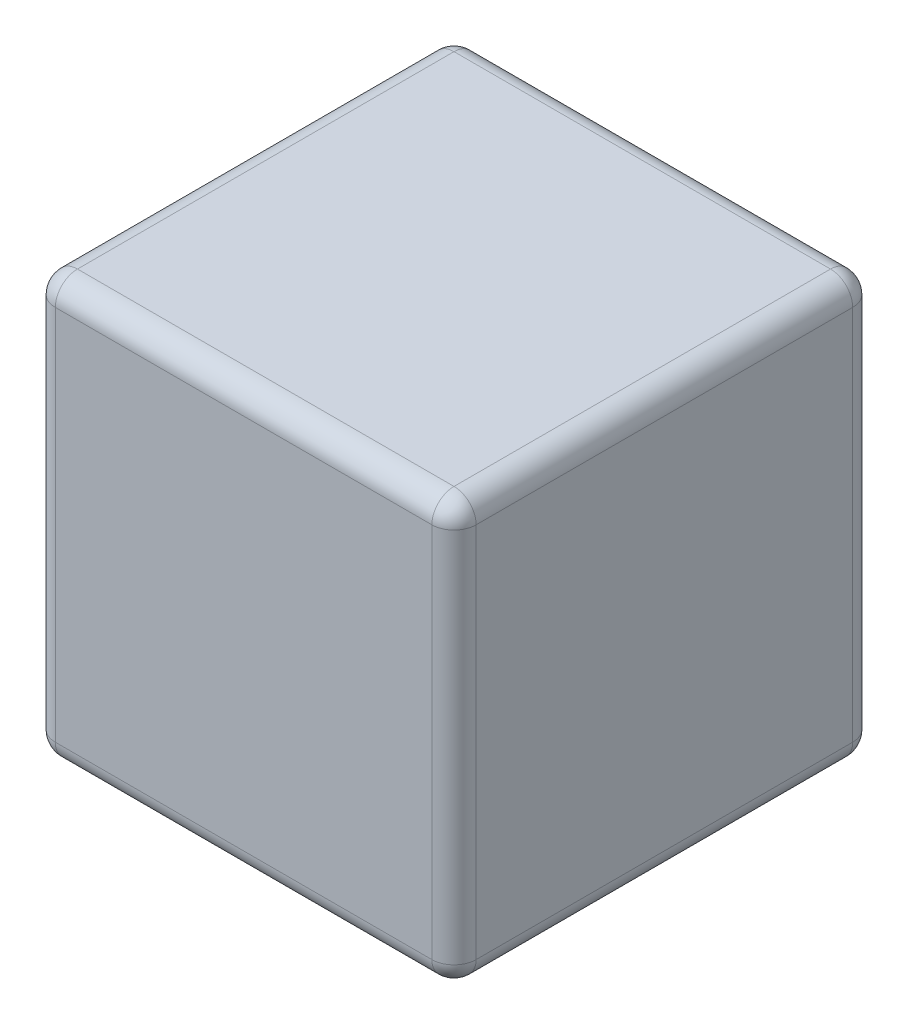
ISO-10303-21;
HEADER;
FILE_DESCRIPTION(('STEP AP214'),'2;1');
FILE_NAME('part.step','',(''),(''),'','','');
FILE_SCHEMA(('AUTOMOTIVE_DESIGN { 1 0 10303 214 1 1 1 1 }'));
ENDSEC;
DATA;
#1=APPLICATION_CONTEXT('core data for automotive mechanical design processes');
#2=APPLICATION_PROTOCOL_DEFINITION('international standard','automotive_design',2000,#1);
#3=PRODUCT_CONTEXT('',#1,'mechanical');
#4=PRODUCT('Part','Part','',(#3));
#5=PRODUCT_RELATED_PRODUCT_CATEGORY('part','',(#4));
#6=PRODUCT_DEFINITION_FORMATION('','',#4);
#7=PRODUCT_DEFINITION_CONTEXT('part definition',#1,'design');
#8=PRODUCT_DEFINITION('design','',#6,#7);
#9=PRODUCT_DEFINITION_SHAPE('','',#8);
#10=(LENGTH_UNIT() NAMED_UNIT(*) SI_UNIT(.MILLI.,.METRE.));
#11=(NAMED_UNIT(*) PLANE_ANGLE_UNIT() SI_UNIT($,.RADIAN.));
#12=(NAMED_UNIT(*) SI_UNIT($,.STERADIAN.) SOLID_ANGLE_UNIT());
#13=UNCERTAINTY_MEASURE_WITH_UNIT(LENGTH_MEASURE(1.E-05),#10,'distance_accuracy_value','');
#14=(GEOMETRIC_REPRESENTATION_CONTEXT(3) GLOBAL_UNCERTAINTY_ASSIGNED_CONTEXT((#13)) GLOBAL_UNIT_ASSIGNED_CONTEXT((#10,
#11,#12)) REPRESENTATION_CONTEXT('',''));
#15=CARTESIAN_POINT('',(0.,0.,0.));
#16=DIRECTION('',(0.,0.,1.));
#17=DIRECTION('',(1.,0.,0.));
#18=AXIS2_PLACEMENT_3D('',#15,#16,#17);
#19=CARTESIAN_POINT('',(955.919230769233,-129.930769230769,241.3));
#20=DIRECTION('',(1.,0.,0.));
#21=DIRECTION('',(0.,0.,-1.));
#22=AXIS2_PLACEMENT_3D('',#19,#20,#21);
#23=PLANE('',#22);
#24=DIRECTION('',(0.,0.,-1.));
#25=VECTOR('',#24,1.);
#26=CARTESIAN_POINT('',(955.919230769233,98.6692307692308,241.3));
#27=LINE('',#26,#25);
#28=CARTESIAN_POINT('',(955.919230769233,98.6692307692308,228.6));
#29=VERTEX_POINT('',#28);
#30=CARTESIAN_POINT('',(955.919230769233,98.6692307692308,12.7));
#31=VERTEX_POINT('',#30);
#32=EDGE_CURVE('E226',#29,#31,#27,.T.);
#33=ORIENTED_EDGE('',*,*,#32,.T.);
#34=DIRECTION('',(0.,-1.,0.));
#35=VECTOR('',#34,1.);
#36=CARTESIAN_POINT('',(955.919230769233,-129.930769230769,12.7));
#37=LINE('',#36,#35);
#38=CARTESIAN_POINT('',(955.919230769233,-117.230769230769,12.7));
#39=VERTEX_POINT('',#38);
#40=EDGE_CURVE('E230',#31,#39,#37,.T.);
#41=ORIENTED_EDGE('',*,*,#40,.T.);
#42=DIRECTION('',(0.,0.,-1.));
#43=VECTOR('',#42,1.);
#44=CARTESIAN_POINT('',(955.919230769233,-117.230769230769,241.3));
#45=LINE('',#44,#43);
#46=CARTESIAN_POINT('',(955.919230769233,-117.230769230769,228.6));
#47=VERTEX_POINT('',#46);
#48=EDGE_CURVE('E223',#39,#47,#45,.F.);
#49=ORIENTED_EDGE('',*,*,#48,.T.);
#50=DIRECTION('',(0.,-1.,0.));
#51=VECTOR('',#50,1.);
#52=CARTESIAN_POINT('',(955.919230769233,-129.930769230769,228.6));
#53=LINE('',#52,#51);
#54=EDGE_CURVE('E220',#47,#29,#53,.F.);
#55=ORIENTED_EDGE('',*,*,#54,.T.);
#56=EDGE_LOOP('',(#33,#41,#49,#55));
#57=FACE_BOUND('',#56,.T.);
#58=ADVANCED_FACE('F39',(#57),#23,.F.);
#59=CARTESIAN_POINT('',(955.919230769233,-129.930769230769,241.3));
#60=DIRECTION('',(0.,1.,0.));
#61=DIRECTION('',(-1.,0.,0.));
#62=AXIS2_PLACEMENT_3D('',#59,#60,#61);
#63=PLANE('',#62);
#64=DIRECTION('',(1.,0.,0.));
#65=VECTOR('',#64,1.);
#66=CARTESIAN_POINT('',(1197.21923076923,-129.930769230769,12.7));
#67=LINE('',#66,#65);
#68=CARTESIAN_POINT('',(968.619230769233,-129.930769230769,12.7));
#69=VERTEX_POINT('',#68);
#70=CARTESIAN_POINT('',(1184.51923076923,-129.930769230769,12.7));
#71=VERTEX_POINT('',#70);
#72=EDGE_CURVE('E144',#69,#71,#67,.T.);
#73=ORIENTED_EDGE('',*,*,#72,.T.);
#74=DIRECTION('',(0.,0.,-1.));
#75=VECTOR('',#74,1.);
#76=CARTESIAN_POINT('',(1184.51923076923,-129.930769230769,241.3));
#77=LINE('',#76,#75);
#78=CARTESIAN_POINT('',(1184.51923076923,-129.930769230769,228.6));
#79=VERTEX_POINT('',#78);
#80=EDGE_CURVE('E139',#71,#79,#77,.F.);
#81=ORIENTED_EDGE('',*,*,#80,.T.);
#82=DIRECTION('',(1.,0.,0.));
#83=VECTOR('',#82,1.);
#84=CARTESIAN_POINT('',(955.919230769233,-129.930769230769,228.6));
#85=LINE('',#84,#83);
#86=CARTESIAN_POINT('',(968.619230769233,-129.930769230769,228.6));
#87=VERTEX_POINT('',#86);
#88=EDGE_CURVE('E131',#79,#87,#85,.F.);
#89=ORIENTED_EDGE('',*,*,#88,.T.);
#90=DIRECTION('',(0.,0.,-1.));
#91=VECTOR('',#90,1.);
#92=CARTESIAN_POINT('',(968.619230769233,-129.930769230769,241.3));
#93=LINE('',#92,#91);
#94=EDGE_CURVE('E136',#87,#69,#93,.T.);
#95=ORIENTED_EDGE('',*,*,#94,.T.);
#96=EDGE_LOOP('',(#73,#81,#89,#95));
#97=FACE_BOUND('',#96,.T.);
#98=ADVANCED_FACE('F134',(#97),#63,.F.);
#99=CARTESIAN_POINT('',(1197.21923076923,-129.930769230769,241.3));
#100=DIRECTION('',(-1.,0.,0.));
#101=DIRECTION('',(0.,0.,1.));
#102=AXIS2_PLACEMENT_3D('',#99,#100,#101);
#103=PLANE('',#102);
#104=DIRECTION('',(0.,0.,-1.));
#105=VECTOR('',#104,1.);
#106=CARTESIAN_POINT('',(1197.21923076923,-117.230769230769,241.3));
#107=LINE('',#106,#105);
#108=CARTESIAN_POINT('',(1197.21923076923,-117.230769230769,228.6));
#109=VERTEX_POINT('',#108);
#110=CARTESIAN_POINT('',(1197.21923076923,-117.230769230769,12.7));
#111=VERTEX_POINT('',#110);
#112=EDGE_CURVE('E49',#109,#111,#107,.T.);
#113=ORIENTED_EDGE('',*,*,#112,.T.);
#114=DIRECTION('',(0.,1.,0.));
#115=VECTOR('',#114,1.);
#116=CARTESIAN_POINT('',(1197.21923076923,111.369230769231,12.7));
#117=LINE('',#116,#115);
#118=CARTESIAN_POINT('',(1197.21923076923,98.6692307692308,12.7));
#119=VERTEX_POINT('',#118);
#120=EDGE_CURVE('E11',#111,#119,#117,.T.);
#121=ORIENTED_EDGE('',*,*,#120,.T.);
#122=DIRECTION('',(0.,0.,-1.));
#123=VECTOR('',#122,1.);
#124=CARTESIAN_POINT('',(1197.21923076923,98.6692307692308,241.3));
#125=LINE('',#124,#123);
#126=CARTESIAN_POINT('',(1197.21923076923,98.6692307692308,228.6));
#127=VERTEX_POINT('',#126);
#128=EDGE_CURVE('E236',#119,#127,#125,.F.);
#129=ORIENTED_EDGE('',*,*,#128,.T.);
#130=DIRECTION('',(0.,1.,0.));
#131=VECTOR('',#130,1.);
#132=CARTESIAN_POINT('',(1197.21923076923,-129.930769230769,228.6));
#133=LINE('',#132,#131);
#134=EDGE_CURVE('E233',#127,#109,#133,.F.);
#135=ORIENTED_EDGE('',*,*,#134,.T.);
#136=EDGE_LOOP('',(#113,#121,#129,#135));
#137=FACE_BOUND('',#136,.T.);
#138=ADVANCED_FACE('F322',(#137),#103,.F.);
#139=CARTESIAN_POINT('',(955.919230769233,111.369230769231,241.3));
#140=DIRECTION('',(0.,-1.,0.));
#141=DIRECTION('',(0.,0.,-1.));
#142=AXIS2_PLACEMENT_3D('',#139,#140,#141);
#143=PLANE('',#142);
#144=DIRECTION('',(-1.,0.,0.));
#145=VECTOR('',#144,1.);
#146=CARTESIAN_POINT('',(955.919230769233,111.369230769231,12.7));
#147=LINE('',#146,#145);
#148=CARTESIAN_POINT('',(1184.51923076923,111.369230769231,12.7));
#149=VERTEX_POINT('',#148);
#150=CARTESIAN_POINT('',(968.619230769233,111.369230769231,12.7));
#151=VERTEX_POINT('',#150);
#152=EDGE_CURVE('E213',#149,#151,#147,.T.);
#153=ORIENTED_EDGE('',*,*,#152,.T.);
#154=DIRECTION('',(0.,0.,-1.));
#155=VECTOR('',#154,1.);
#156=CARTESIAN_POINT('',(968.619230769233,111.369230769231,241.3));
#157=LINE('',#156,#155);
#158=CARTESIAN_POINT('',(968.619230769233,111.369230769231,228.6));
#159=VERTEX_POINT('',#158);
#160=EDGE_CURVE('E217',#151,#159,#157,.F.);
#161=ORIENTED_EDGE('',*,*,#160,.T.);
#162=DIRECTION('',(-1.,0.,0.));
#163=VECTOR('',#162,1.);
#164=CARTESIAN_POINT('',(955.919230769233,111.369230769231,228.6));
#165=LINE('',#164,#163);
#166=CARTESIAN_POINT('',(1184.51923076923,111.369230769231,228.6));
#167=VERTEX_POINT('',#166);
#168=EDGE_CURVE('E210',#159,#167,#165,.F.);
#169=ORIENTED_EDGE('',*,*,#168,.T.);
#170=DIRECTION('',(0.,0.,-1.));
#171=VECTOR('',#170,1.);
#172=CARTESIAN_POINT('',(1184.51923076923,111.369230769231,241.3));
#173=LINE('',#172,#171);
#174=EDGE_CURVE('E207',#167,#149,#173,.T.);
#175=ORIENTED_EDGE('',*,*,#174,.T.);
#176=EDGE_LOOP('',(#153,#161,#169,#175));
#177=FACE_BOUND('',#176,.T.);
#178=ADVANCED_FACE('F329',(#177),#143,.F.);
#179=CARTESIAN_POINT('',(0.,0.,241.3));
#180=DIRECTION('',(0.,0.,-1.));
#181=DIRECTION('',(-1.,0.,0.));
#182=AXIS2_PLACEMENT_3D('',#179,#180,#181);
#183=PLANE('',#182);
#184=DIRECTION('',(-1.,0.,0.));
#185=VECTOR('',#184,1.);
#186=CARTESIAN_POINT('',(0.,98.6692307692308,241.3));
#187=LINE('',#186,#185);
#188=CARTESIAN_POINT('',(1184.51923076923,98.6692307692308,241.3));
#189=VERTEX_POINT('',#188);
#190=CARTESIAN_POINT('',(968.619230769233,98.6692307692308,241.3));
#191=VERTEX_POINT('',#190);
#192=EDGE_CURVE('E199',#189,#191,#187,.T.);
#193=ORIENTED_EDGE('',*,*,#192,.T.);
#194=DIRECTION('',(0.,-1.,0.));
#195=VECTOR('',#194,1.);
#196=CARTESIAN_POINT('',(968.619230769233,0.,241.3));
#197=LINE('',#196,#195);
#198=CARTESIAN_POINT('',(968.619230769233,-117.230769230769,241.3));
#199=VERTEX_POINT('',#198);
#200=EDGE_CURVE('E204',#191,#199,#197,.T.);
#201=ORIENTED_EDGE('',*,*,#200,.T.);
#202=DIRECTION('',(1.,0.,0.));
#203=VECTOR('',#202,1.);
#204=CARTESIAN_POINT('',(0.,-117.230769230769,241.3));
#205=LINE('',#204,#203);
#206=CARTESIAN_POINT('',(1184.51923076923,-117.230769230769,241.3));
#207=VERTEX_POINT('',#206);
#208=EDGE_CURVE('E152',#199,#207,#205,.T.);
#209=ORIENTED_EDGE('',*,*,#208,.T.);
#210=DIRECTION('',(0.,1.,0.));
#211=VECTOR('',#210,1.);
#212=CARTESIAN_POINT('',(1184.51923076923,0.,241.3));
#213=LINE('',#212,#211);
#214=EDGE_CURVE('E196',#207,#189,#213,.T.);
#215=ORIENTED_EDGE('',*,*,#214,.T.);
#216=EDGE_LOOP('',(#193,#201,#209,#215));
#217=FACE_BOUND('',#216,.T.);
#218=ADVANCED_FACE('F353',(#217),#183,.F.);
#219=CARTESIAN_POINT('',(0.,0.,0.));
#220=DIRECTION('',(0.,0.,-1.));
#221=DIRECTION('',(-1.,0.,0.));
#222=AXIS2_PLACEMENT_3D('',#219,#220,#221);
#223=PLANE('',#222);
#224=DIRECTION('',(1.,0.,0.));
#225=VECTOR('',#224,1.);
#226=CARTESIAN_POINT('',(955.919230769233,-117.230769230769,0.));
#227=LINE('',#226,#225);
#228=CARTESIAN_POINT('',(1184.51923076923,-117.230769230769,0.));
#229=VERTEX_POINT('',#228);
#230=CARTESIAN_POINT('',(968.619230769233,-117.230769230769,0.));
#231=VERTEX_POINT('',#230);
#232=EDGE_CURVE('E189',#229,#231,#227,.F.);
#233=ORIENTED_EDGE('',*,*,#232,.T.);
#234=DIRECTION('',(0.,-1.,0.));
#235=VECTOR('',#234,1.);
#236=CARTESIAN_POINT('',(968.619230769233,111.369230769231,0.));
#237=LINE('',#236,#235);
#238=CARTESIAN_POINT('',(968.619230769233,98.6692307692308,0.));
#239=VERTEX_POINT('',#238);
#240=EDGE_CURVE('E193',#231,#239,#237,.F.);
#241=ORIENTED_EDGE('',*,*,#240,.T.);
#242=DIRECTION('',(-1.,0.,0.));
#243=VECTOR('',#242,1.);
#244=CARTESIAN_POINT('',(1197.21923076923,98.6692307692308,0.));
#245=LINE('',#244,#243);
#246=CARTESIAN_POINT('',(1184.51923076923,98.6692307692308,0.));
#247=VERTEX_POINT('',#246);
#248=EDGE_CURVE('E186',#239,#247,#245,.F.);
#249=ORIENTED_EDGE('',*,*,#248,.T.);
#250=DIRECTION('',(0.,1.,0.));
#251=VECTOR('',#250,1.);
#252=CARTESIAN_POINT('',(1184.51923076923,-129.930769230769,0.));
#253=LINE('',#252,#251);
#254=EDGE_CURVE('E183',#247,#229,#253,.F.);
#255=ORIENTED_EDGE('',*,*,#254,.T.);
#256=EDGE_LOOP('',(#233,#241,#249,#255));
#257=FACE_BOUND('',#256,.T.);
#258=ADVANCED_FACE('F355',(#257),#223,.T.);
#259=CARTESIAN_POINT('',(0.,98.6692307692308,228.6));
#260=DIRECTION('',(-1.,0.,0.));
#261=DIRECTION('',(0.,0.,1.));
#262=AXIS2_PLACEMENT_3D('',#259,#260,#261);
#263=CYLINDRICAL_SURFACE('',#262,12.7);
#264=CARTESIAN_POINT('',(968.619230769233,98.6692307692308,228.6));
#265=DIRECTION('',(-1.,0.,0.));
#266=DIRECTION('',(0.,0.,1.));
#267=AXIS2_PLACEMENT_3D('',#264,#265,#266);
#268=CIRCLE('',#267,12.7);
#269=EDGE_CURVE('E43',#191,#159,#268,.T.);
#270=ORIENTED_EDGE('',*,*,#269,.F.);
#271=ORIENTED_EDGE('',*,*,#192,.F.);
#272=CARTESIAN_POINT('',(1184.51923076923,98.6692307692308,228.6));
#273=DIRECTION('',(1.,0.,0.));
#274=DIRECTION('',(0.,0.,-1.));
#275=AXIS2_PLACEMENT_3D('',#272,#273,#274);
#276=CIRCLE('',#275,12.7);
#277=EDGE_CURVE('E177',#167,#189,#276,.T.);
#278=ORIENTED_EDGE('',*,*,#277,.F.);
#279=ORIENTED_EDGE('',*,*,#168,.F.);
#280=EDGE_LOOP('',(#270,#271,#278,#279));
#281=FACE_BOUND('',#280,.T.);
#282=ADVANCED_FACE('F41',(#281),#263,.T.);
#283=CARTESIAN_POINT('',(968.619230769233,98.6692307692308,228.6));
#284=DIRECTION('',(0.,1.,0.));
#285=DIRECTION('',(0.,0.,1.));
#286=AXIS2_PLACEMENT_3D('',#283,#284,#285);
#287=SPHERICAL_SURFACE('',#286,12.7);
#288=CARTESIAN_POINT('',(968.619230769233,98.6692307692308,228.6));
#289=DIRECTION('',(0.,1.,0.));
#290=DIRECTION('',(0.,0.,1.));
#291=AXIS2_PLACEMENT_3D('',#288,#289,#290);
#292=CIRCLE('',#291,12.7);
#293=EDGE_CURVE('E298',#191,#29,#292,.F.);
#294=ORIENTED_EDGE('',*,*,#293,.F.);
#295=ORIENTED_EDGE('',*,*,#269,.T.);
#296=CARTESIAN_POINT('',(968.619230769233,98.6692307692308,228.6));
#297=DIRECTION('',(0.,0.,1.));
#298=DIRECTION('',(1.,0.,0.));
#299=AXIS2_PLACEMENT_3D('',#296,#297,#298);
#300=CIRCLE('',#299,12.7);
#301=EDGE_CURVE('E302',#29,#159,#300,.F.);
#302=ORIENTED_EDGE('',*,*,#301,.F.);
#303=EDGE_LOOP('',(#294,#295,#302));
#304=FACE_BOUND('',#303,.T.);
#305=ADVANCED_FACE('F347',(#304),#287,.T.);
#306=CARTESIAN_POINT('',(1184.51923076923,98.6692307692308,228.6));
#307=DIRECTION('',(0.,0.,1.));
#308=DIRECTION('',(1.,0.,0.));
#309=AXIS2_PLACEMENT_3D('',#306,#307,#308);
#310=SPHERICAL_SURFACE('',#309,12.7);
#311=CARTESIAN_POINT('',(1184.51923076923,98.6692307692308,228.6));
#312=DIRECTION('',(0.,0.,1.));
#313=DIRECTION('',(1.,0.,0.));
#314=AXIS2_PLACEMENT_3D('',#311,#312,#313);
#315=CIRCLE('',#314,12.7);
#316=EDGE_CURVE('E290',#167,#127,#315,.F.);
#317=ORIENTED_EDGE('',*,*,#316,.F.);
#318=ORIENTED_EDGE('',*,*,#277,.T.);
#319=CARTESIAN_POINT('',(1184.51923076923,98.6692307692308,228.6));
#320=DIRECTION('',(0.,1.,0.));
#321=DIRECTION('',(0.,0.,1.));
#322=AXIS2_PLACEMENT_3D('',#319,#320,#321);
#323=CIRCLE('',#322,12.7);
#324=EDGE_CURVE('E294',#127,#189,#323,.F.);
#325=ORIENTED_EDGE('',*,*,#324,.F.);
#326=EDGE_LOOP('',(#317,#318,#325));
#327=FACE_BOUND('',#326,.T.);
#328=ADVANCED_FACE('F311',(#327),#310,.T.);
#329=CARTESIAN_POINT('',(968.619230769233,98.6692307692308,241.3));
#330=DIRECTION('',(0.,0.,-1.));
#331=DIRECTION('',(-1.,0.,0.));
#332=AXIS2_PLACEMENT_3D('',#329,#330,#331);
#333=CYLINDRICAL_SURFACE('',#332,12.7);
#334=ORIENTED_EDGE('',*,*,#301,.T.);
#335=ORIENTED_EDGE('',*,*,#160,.F.);
#336=CARTESIAN_POINT('',(968.619230769233,98.6692307692308,12.7));
#337=DIRECTION('',(0.,0.,-1.));
#338=DIRECTION('',(-1.,0.,0.));
#339=AXIS2_PLACEMENT_3D('',#336,#337,#338);
#340=CIRCLE('',#339,12.7);
#341=EDGE_CURVE('E283',#31,#151,#340,.T.);
#342=ORIENTED_EDGE('',*,*,#341,.F.);
#343=ORIENTED_EDGE('',*,*,#32,.F.);
#344=EDGE_LOOP('',(#334,#335,#342,#343));
#345=FACE_BOUND('',#344,.T.);
#346=ADVANCED_FACE('F341',(#345),#333,.T.);
#347=CARTESIAN_POINT('',(968.619230769233,0.,228.6));
#348=DIRECTION('',(0.,-1.,0.));
#349=DIRECTION('',(0.,0.,-1.));
#350=AXIS2_PLACEMENT_3D('',#347,#348,#349);
#351=CYLINDRICAL_SURFACE('',#350,12.7);
#352=ORIENTED_EDGE('',*,*,#293,.T.);
#353=ORIENTED_EDGE('',*,*,#54,.F.);
#354=CARTESIAN_POINT('',(968.619230769233,-117.230769230769,228.6));
#355=DIRECTION('',(0.,-1.,0.));
#356=DIRECTION('',(0.,0.,-1.));
#357=AXIS2_PLACEMENT_3D('',#354,#355,#356);
#358=CIRCLE('',#357,12.7);
#359=EDGE_CURVE('E157',#199,#47,#358,.T.);
#360=ORIENTED_EDGE('',*,*,#359,.F.);
#361=ORIENTED_EDGE('',*,*,#200,.F.);
#362=EDGE_LOOP('',(#352,#353,#360,#361));
#363=FACE_BOUND('',#362,.T.);
#364=ADVANCED_FACE('F351',(#363),#351,.T.);
#365=CARTESIAN_POINT('',(0.,-117.230769230769,228.6));
#366=DIRECTION('',(1.,0.,0.));
#367=DIRECTION('',(0.,1.,0.));
#368=AXIS2_PLACEMENT_3D('',#365,#366,#367);
#369=CYLINDRICAL_SURFACE('',#368,12.7);
#370=CARTESIAN_POINT('',(1184.51923076923,-117.230769230769,228.6));
#371=DIRECTION('',(1.,0.,0.));
#372=DIRECTION('',(0.,0.,-1.));
#373=AXIS2_PLACEMENT_3D('',#370,#371,#372);
#374=CIRCLE('',#373,12.7);
#375=EDGE_CURVE('E158',#207,#79,#374,.T.);
#376=ORIENTED_EDGE('',*,*,#375,.F.);
#377=ORIENTED_EDGE('',*,*,#208,.F.);
#378=CARTESIAN_POINT('',(968.619230769233,-117.230769230769,228.6));
#379=DIRECTION('',(-1.,0.,0.));
#380=DIRECTION('',(0.,0.,1.));
#381=AXIS2_PLACEMENT_3D('',#378,#379,#380);
#382=CIRCLE('',#381,12.7);
#383=EDGE_CURVE('E148',#87,#199,#382,.T.);
#384=ORIENTED_EDGE('',*,*,#383,.F.);
#385=ORIENTED_EDGE('',*,*,#88,.F.);
#386=EDGE_LOOP('',(#376,#377,#384,#385));
#387=FACE_BOUND('',#386,.T.);
#388=ADVANCED_FACE('F150',(#387),#369,.T.);
#389=CARTESIAN_POINT('',(1184.51923076923,0.,228.6));
#390=DIRECTION('',(0.,1.,0.));
#391=DIRECTION('',(0.,0.,1.));
#392=AXIS2_PLACEMENT_3D('',#389,#390,#391);
#393=CYLINDRICAL_SURFACE('',#392,12.7);
#394=ORIENTED_EDGE('',*,*,#324,.T.);
#395=ORIENTED_EDGE('',*,*,#214,.F.);
#396=CARTESIAN_POINT('',(1184.51923076923,-117.230769230769,228.6));
#397=DIRECTION('',(0.,-1.,0.));
#398=DIRECTION('',(0.,0.,-1.));
#399=AXIS2_PLACEMENT_3D('',#396,#397,#398);
#400=CIRCLE('',#399,12.7);
#401=EDGE_CURVE('E276',#109,#207,#400,.T.);
#402=ORIENTED_EDGE('',*,*,#401,.F.);
#403=ORIENTED_EDGE('',*,*,#134,.F.);
#404=EDGE_LOOP('',(#394,#395,#402,#403));
#405=FACE_BOUND('',#404,.T.);
#406=ADVANCED_FACE('F319',(#405),#393,.T.);
#407=CARTESIAN_POINT('',(1184.51923076923,98.6692307692308,241.3));
#408=DIRECTION('',(0.,0.,-1.));
#409=DIRECTION('',(-1.,0.,0.));
#410=AXIS2_PLACEMENT_3D('',#407,#408,#409);
#411=CYLINDRICAL_SURFACE('',#410,12.7);
#412=ORIENTED_EDGE('',*,*,#316,.T.);
#413=ORIENTED_EDGE('',*,*,#128,.F.);
#414=CARTESIAN_POINT('',(1184.51923076923,98.6692307692308,12.7));
#415=DIRECTION('',(0.,0.,-1.));
#416=DIRECTION('',(-1.,0.,0.));
#417=AXIS2_PLACEMENT_3D('',#414,#415,#416);
#418=CIRCLE('',#417,12.7);
#419=EDGE_CURVE('E272',#149,#119,#418,.T.);
#420=ORIENTED_EDGE('',*,*,#419,.F.);
#421=ORIENTED_EDGE('',*,*,#174,.F.);
#422=EDGE_LOOP('',(#412,#413,#420,#421));
#423=FACE_BOUND('',#422,.T.);
#424=ADVANCED_FACE('F326',(#423),#411,.T.);
#425=CARTESIAN_POINT('',(955.919230769233,98.6692307692308,12.7));
#426=DIRECTION('',(1.,0.,0.));
#427=DIRECTION('',(0.,0.,-1.));
#428=AXIS2_PLACEMENT_3D('',#425,#426,#427);
#429=CYLINDRICAL_SURFACE('',#428,12.7);
#430=CARTESIAN_POINT('',(968.619230769233,98.6692307692308,12.7));
#431=DIRECTION('',(-1.,0.,0.));
#432=DIRECTION('',(0.,0.,1.));
#433=AXIS2_PLACEMENT_3D('',#430,#431,#432);
#434=CIRCLE('',#433,12.7);
#435=EDGE_CURVE('E286',#151,#239,#434,.T.);
#436=ORIENTED_EDGE('',*,*,#435,.F.);
#437=ORIENTED_EDGE('',*,*,#152,.F.);
#438=CARTESIAN_POINT('',(1184.51923076923,98.6692307692308,12.7));
#439=DIRECTION('',(1.,0.,0.));
#440=DIRECTION('',(0.,0.,-1.));
#441=AXIS2_PLACEMENT_3D('',#438,#439,#440);
#442=CIRCLE('',#441,12.7);
#443=EDGE_CURVE('E268',#247,#149,#442,.T.);
#444=ORIENTED_EDGE('',*,*,#443,.F.);
#445=ORIENTED_EDGE('',*,*,#248,.F.);
#446=EDGE_LOOP('',(#436,#437,#444,#445));
#447=FACE_BOUND('',#446,.T.);
#448=ADVANCED_FACE('F333',(#447),#429,.T.);
#449=CARTESIAN_POINT('',(968.619230769233,98.6692307692308,12.7));
#450=DIRECTION('',(0.,1.,0.));
#451=DIRECTION('',(0.,0.,1.));
#452=AXIS2_PLACEMENT_3D('',#449,#450,#451);
#453=SPHERICAL_SURFACE('',#452,12.7);
#454=ORIENTED_EDGE('',*,*,#341,.T.);
#455=ORIENTED_EDGE('',*,*,#435,.T.);
#456=CARTESIAN_POINT('',(968.619230769233,98.6692307692308,12.7));
#457=DIRECTION('',(0.,1.,0.));
#458=DIRECTION('',(-1.,0.,0.));
#459=AXIS2_PLACEMENT_3D('',#456,#457,#458);
#460=CIRCLE('',#459,12.7);
#461=EDGE_CURVE('E166',#31,#239,#460,.F.);
#462=ORIENTED_EDGE('',*,*,#461,.F.);
#463=EDGE_LOOP('',(#454,#455,#462));
#464=FACE_BOUND('',#463,.T.);
#465=ADVANCED_FACE('F408',(#464),#453,.T.);
#466=CARTESIAN_POINT('',(968.619230769233,-117.230769230769,228.6));
#467=DIRECTION('',(0.,0.,1.));
#468=DIRECTION('',(1.,0.,0.));
#469=AXIS2_PLACEMENT_3D('',#466,#467,#468);
#470=SPHERICAL_SURFACE('',#469,12.7);
#471=ORIENTED_EDGE('',*,*,#383,.T.);
#472=ORIENTED_EDGE('',*,*,#359,.T.);
#473=CARTESIAN_POINT('',(968.619230769233,-117.230769230769,228.6));
#474=DIRECTION('',(0.,0.,1.));
#475=DIRECTION('',(1.,0.,0.));
#476=AXIS2_PLACEMENT_3D('',#473,#474,#475);
#477=CIRCLE('',#476,12.7);
#478=EDGE_CURVE('E161',#87,#47,#477,.F.);
#479=ORIENTED_EDGE('',*,*,#478,.F.);
#480=EDGE_LOOP('',(#471,#472,#479));
#481=FACE_BOUND('',#480,.T.);
#482=ADVANCED_FACE('F162',(#481),#470,.T.);
#483=CARTESIAN_POINT('',(1184.51923076923,-117.230769230769,228.6));
#484=DIRECTION('',(0.,0.,1.));
#485=DIRECTION('',(1.,0.,0.));
#486=AXIS2_PLACEMENT_3D('',#483,#484,#485);
#487=SPHERICAL_SURFACE('',#486,12.7);
#488=ORIENTED_EDGE('',*,*,#401,.T.);
#489=ORIENTED_EDGE('',*,*,#375,.T.);
#490=CARTESIAN_POINT('',(1184.51923076923,-117.230769230769,228.6));
#491=DIRECTION('',(0.,0.,1.));
#492=DIRECTION('',(1.,0.,0.));
#493=AXIS2_PLACEMENT_3D('',#490,#491,#492);
#494=CIRCLE('',#493,12.7);
#495=EDGE_CURVE('E167',#109,#79,#494,.F.);
#496=ORIENTED_EDGE('',*,*,#495,.F.);
#497=EDGE_LOOP('',(#488,#489,#496));
#498=FACE_BOUND('',#497,.T.);
#499=ADVANCED_FACE('F401',(#498),#487,.T.);
#500=CARTESIAN_POINT('',(1184.51923076923,98.6692307692308,12.7));
#501=DIRECTION('',(0.,1.,0.));
#502=DIRECTION('',(0.,0.,1.));
#503=AXIS2_PLACEMENT_3D('',#500,#501,#502);
#504=SPHERICAL_SURFACE('',#503,12.7);
#505=ORIENTED_EDGE('',*,*,#443,.T.);
#506=ORIENTED_EDGE('',*,*,#419,.T.);
#507=CARTESIAN_POINT('',(1184.51923076923,98.6692307692308,12.7));
#508=DIRECTION('',(0.,1.,0.));
#509=DIRECTION('',(0.,0.,1.));
#510=AXIS2_PLACEMENT_3D('',#507,#508,#509);
#511=CIRCLE('',#510,12.7);
#512=EDGE_CURVE('E258',#247,#119,#511,.F.);
#513=ORIENTED_EDGE('',*,*,#512,.F.);
#514=EDGE_LOOP('',(#505,#506,#513));
#515=FACE_BOUND('',#514,.T.);
#516=ADVANCED_FACE('F397',(#515),#504,.T.);
#517=CARTESIAN_POINT('',(968.619230769233,-129.930769230769,12.7));
#518=DIRECTION('',(0.,1.,0.));
#519=DIRECTION('',(0.,0.,1.));
#520=AXIS2_PLACEMENT_3D('',#517,#518,#519);
#521=CYLINDRICAL_SURFACE('',#520,12.7);
#522=ORIENTED_EDGE('',*,*,#461,.T.);
#523=ORIENTED_EDGE('',*,*,#240,.F.);
#524=CARTESIAN_POINT('',(968.619230769233,-117.230769230769,12.7));
#525=DIRECTION('',(0.,-1.,0.));
#526=DIRECTION('',(0.,0.,-1.));
#527=AXIS2_PLACEMENT_3D('',#524,#525,#526);
#528=CIRCLE('',#527,12.7);
#529=EDGE_CURVE('E254',#39,#231,#528,.T.);
#530=ORIENTED_EDGE('',*,*,#529,.F.);
#531=ORIENTED_EDGE('',*,*,#40,.F.);
#532=EDGE_LOOP('',(#522,#523,#530,#531));
#533=FACE_BOUND('',#532,.T.);
#534=ADVANCED_FACE('F394',(#533),#521,.T.);
#535=CARTESIAN_POINT('',(968.619230769233,-117.230769230769,241.3));
#536=DIRECTION('',(0.,0.,-1.));
#537=DIRECTION('',(-1.,0.,0.));
#538=AXIS2_PLACEMENT_3D('',#535,#536,#537);
#539=CYLINDRICAL_SURFACE('',#538,12.7);
#540=ORIENTED_EDGE('',*,*,#478,.T.);
#541=ORIENTED_EDGE('',*,*,#48,.F.);
#542=CARTESIAN_POINT('',(968.619230769233,-117.230769230769,12.7));
#543=DIRECTION('',(0.,0.,-1.));
#544=DIRECTION('',(-1.,0.,0.));
#545=AXIS2_PLACEMENT_3D('',#542,#543,#544);
#546=CIRCLE('',#545,12.7);
#547=EDGE_CURVE('E171',#69,#39,#546,.T.);
#548=ORIENTED_EDGE('',*,*,#547,.F.);
#549=ORIENTED_EDGE('',*,*,#94,.F.);
#550=EDGE_LOOP('',(#540,#541,#548,#549));
#551=FACE_BOUND('',#550,.T.);
#552=ADVANCED_FACE('F169',(#551),#539,.T.);
#553=CARTESIAN_POINT('',(1184.51923076923,-117.230769230769,241.3));
#554=DIRECTION('',(0.,0.,-1.));
#555=DIRECTION('',(-1.,0.,0.));
#556=AXIS2_PLACEMENT_3D('',#553,#554,#555);
#557=CYLINDRICAL_SURFACE('',#556,12.7);
#558=ORIENTED_EDGE('',*,*,#495,.T.);
#559=ORIENTED_EDGE('',*,*,#80,.F.);
#560=CARTESIAN_POINT('',(1184.51923076923,-117.230769230769,12.7));
#561=DIRECTION('',(0.,0.,-1.));
#562=DIRECTION('',(-1.,0.,0.));
#563=AXIS2_PLACEMENT_3D('',#560,#561,#562);
#564=CIRCLE('',#563,12.7);
#565=EDGE_CURVE('E249',#111,#71,#564,.T.);
#566=ORIENTED_EDGE('',*,*,#565,.F.);
#567=ORIENTED_EDGE('',*,*,#112,.F.);
#568=EDGE_LOOP('',(#558,#559,#566,#567));
#569=FACE_BOUND('',#568,.T.);
#570=ADVANCED_FACE('F387',(#569),#557,.T.);
#571=CARTESIAN_POINT('',(1184.51923076923,-129.930769230769,12.7));
#572=DIRECTION('',(0.,-1.,0.));
#573=DIRECTION('',(0.,0.,-1.));
#574=AXIS2_PLACEMENT_3D('',#571,#572,#573);
#575=CYLINDRICAL_SURFACE('',#574,12.7);
#576=ORIENTED_EDGE('',*,*,#512,.T.);
#577=ORIENTED_EDGE('',*,*,#120,.F.);
#578=CARTESIAN_POINT('',(1184.51923076923,-117.230769230769,12.7));
#579=DIRECTION('',(0.,-1.,0.));
#580=DIRECTION('',(0.,0.,-1.));
#581=AXIS2_PLACEMENT_3D('',#578,#579,#580);
#582=CIRCLE('',#581,12.7);
#583=EDGE_CURVE('E57',#229,#111,#582,.T.);
#584=ORIENTED_EDGE('',*,*,#583,.F.);
#585=ORIENTED_EDGE('',*,*,#254,.F.);
#586=EDGE_LOOP('',(#576,#577,#584,#585));
#587=FACE_BOUND('',#586,.T.);
#588=ADVANCED_FACE('F383',(#587),#575,.T.);
#589=CARTESIAN_POINT('',(968.619230769233,-117.230769230769,12.7));
#590=DIRECTION('',(-1.,0.,0.));
#591=DIRECTION('',(0.,0.,1.));
#592=AXIS2_PLACEMENT_3D('',#589,#590,#591);
#593=SPHERICAL_SURFACE('',#592,12.7);
#594=ORIENTED_EDGE('',*,*,#547,.T.);
#595=ORIENTED_EDGE('',*,*,#529,.T.);
#596=CARTESIAN_POINT('',(968.619230769233,-117.230769230769,12.7));
#597=DIRECTION('',(-1.,0.,0.));
#598=DIRECTION('',(0.,0.,1.));
#599=AXIS2_PLACEMENT_3D('',#596,#597,#598);
#600=CIRCLE('',#599,12.7);
#601=EDGE_CURVE('E244',#69,#231,#600,.F.);
#602=ORIENTED_EDGE('',*,*,#601,.F.);
#603=EDGE_LOOP('',(#594,#595,#602));
#604=FACE_BOUND('',#603,.T.);
#605=ADVANCED_FACE('F380',(#604),#593,.T.);
#606=CARTESIAN_POINT('',(1184.51923076923,-117.230769230769,12.7));
#607=DIRECTION('',(1.,0.,0.));
#608=DIRECTION('',(0.,0.,-1.));
#609=AXIS2_PLACEMENT_3D('',#606,#607,#608);
#610=SPHERICAL_SURFACE('',#609,12.7);
#611=ORIENTED_EDGE('',*,*,#583,.T.);
#612=ORIENTED_EDGE('',*,*,#565,.T.);
#613=CARTESIAN_POINT('',(1184.51923076923,-117.230769230769,12.7));
#614=DIRECTION('',(1.,0.,0.));
#615=DIRECTION('',(0.,0.,-1.));
#616=AXIS2_PLACEMENT_3D('',#613,#614,#615);
#617=CIRCLE('',#616,12.7);
#618=EDGE_CURVE('E241',#229,#71,#617,.F.);
#619=ORIENTED_EDGE('',*,*,#618,.F.);
#620=EDGE_LOOP('',(#611,#612,#619));
#621=FACE_BOUND('',#620,.T.);
#622=ADVANCED_FACE('F376',(#621),#610,.T.);
#623=CARTESIAN_POINT('',(955.919230769233,-117.230769230769,12.7));
#624=DIRECTION('',(-1.,0.,0.));
#625=DIRECTION('',(0.,-1.,0.));
#626=AXIS2_PLACEMENT_3D('',#623,#624,#625);
#627=CYLINDRICAL_SURFACE('',#626,12.7);
#628=ORIENTED_EDGE('',*,*,#601,.T.);
#629=ORIENTED_EDGE('',*,*,#232,.F.);
#630=ORIENTED_EDGE('',*,*,#618,.T.);
#631=ORIENTED_EDGE('',*,*,#72,.F.);
#632=EDGE_LOOP('',(#628,#629,#630,#631));
#633=FACE_BOUND('',#632,.T.);
#634=ADVANCED_FACE('F373',(#633),#627,.T.);
#635=CLOSED_SHELL('',(#58,#98,#138,#178,#218,#258,#282,#305,#328,#346,#364,#388,#406,#424,#448,
#465,#482,#499,#516,#534,#552,#570,#588,#605,#622,#634));
#636=MANIFOLD_SOLID_BREP('B2',#635);
#637=ADVANCED_BREP_SHAPE_REPRESENTATION('',(#18,#636),#14);
#638=SHAPE_DEFINITION_REPRESENTATION(#9,#637);
ENDSEC;
END-ISO-10303-21;
